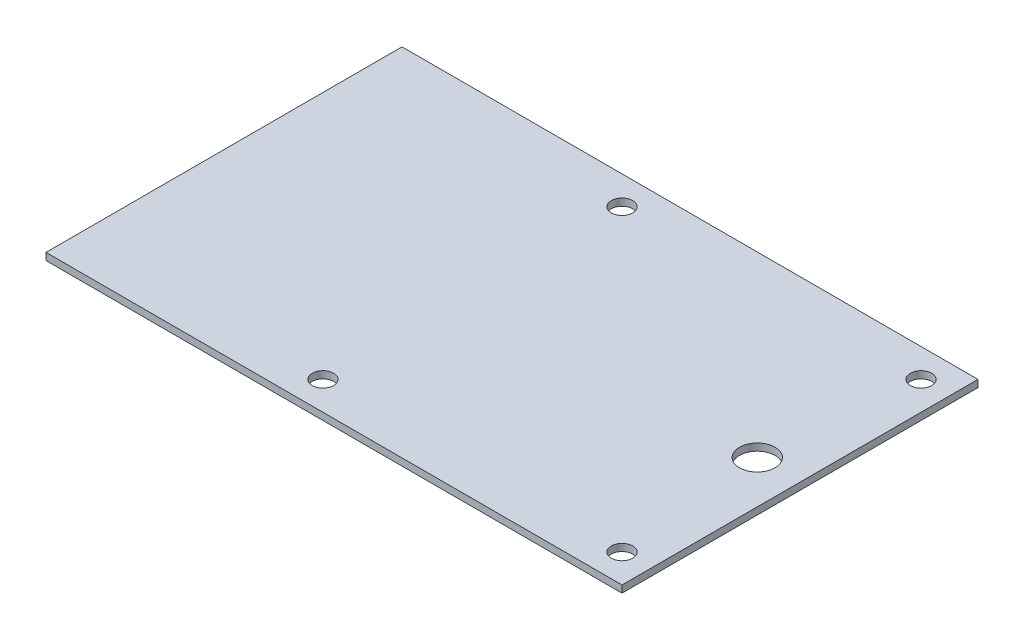
ISO-10303-21;
HEADER;
FILE_DESCRIPTION(('STEP AP214'),'2;1');
FILE_NAME('part.step','',(''),(''),'','','');
FILE_SCHEMA(('AUTOMOTIVE_DESIGN { 1 0 10303 214 1 1 1 1 }'));
ENDSEC;
DATA;
#1=APPLICATION_CONTEXT('core data for automotive mechanical design processes');
#2=APPLICATION_PROTOCOL_DEFINITION('international standard','automotive_design',2000,#1);
#3=PRODUCT_CONTEXT('',#1,'mechanical');
#4=PRODUCT('Part','Part','',(#3));
#5=PRODUCT_RELATED_PRODUCT_CATEGORY('part','',(#4));
#6=PRODUCT_DEFINITION_FORMATION('','',#4);
#7=PRODUCT_DEFINITION_CONTEXT('part definition',#1,'design');
#8=PRODUCT_DEFINITION('design','',#6,#7);
#9=PRODUCT_DEFINITION_SHAPE('','',#8);
#10=(LENGTH_UNIT() NAMED_UNIT(*) SI_UNIT(.MILLI.,.METRE.));
#11=(NAMED_UNIT(*) PLANE_ANGLE_UNIT() SI_UNIT($,.RADIAN.));
#12=(NAMED_UNIT(*) SI_UNIT($,.STERADIAN.) SOLID_ANGLE_UNIT());
#13=UNCERTAINTY_MEASURE_WITH_UNIT(LENGTH_MEASURE(1.E-05),#10,'distance_accuracy_value','');
#14=(GEOMETRIC_REPRESENTATION_CONTEXT(3) GLOBAL_UNCERTAINTY_ASSIGNED_CONTEXT((#13)) GLOBAL_UNIT_ASSIGNED_CONTEXT((#10,
#11,#12)) REPRESENTATION_CONTEXT('',''));
#15=CARTESIAN_POINT('',(0.,0.,0.));
#16=DIRECTION('',(0.,0.,1.));
#17=DIRECTION('',(1.,0.,0.));
#18=AXIS2_PLACEMENT_3D('',#15,#16,#17);
#19=CARTESIAN_POINT('',(40.45,1.,25.));
#20=DIRECTION('',(-1.,0.,0.));
#21=DIRECTION('',(0.,0.,1.));
#22=AXIS2_PLACEMENT_3D('',#19,#20,#21);
#23=PLANE('',#22);
#24=DIRECTION('',(0.,0.,-1.));
#25=VECTOR('',#24,1.);
#26=CARTESIAN_POINT('',(40.45,0.,25.));
#27=LINE('',#26,#25);
#28=CARTESIAN_POINT('',(40.45,0.,25.));
#29=VERTEX_POINT('',#28);
#30=CARTESIAN_POINT('',(40.45,0.,-25.));
#31=VERTEX_POINT('',#30);
#32=EDGE_CURVE('E97',#29,#31,#27,.T.);
#33=ORIENTED_EDGE('',*,*,#32,.T.);
#34=DIRECTION('',(0.,-1.,0.));
#35=VECTOR('',#34,1.);
#36=CARTESIAN_POINT('',(40.45,1.,-25.));
#37=LINE('',#36,#35);
#38=CARTESIAN_POINT('',(40.45,1.,-25.));
#39=VERTEX_POINT('',#38);
#40=EDGE_CURVE('E11',#39,#31,#37,.T.);
#41=ORIENTED_EDGE('',*,*,#40,.F.);
#42=DIRECTION('',(0.,0.,-1.));
#43=VECTOR('',#42,1.);
#44=CARTESIAN_POINT('',(40.45,1.,25.));
#45=LINE('',#44,#43);
#46=CARTESIAN_POINT('',(40.45,1.,25.));
#47=VERTEX_POINT('',#46);
#48=EDGE_CURVE('E85',#47,#39,#45,.T.);
#49=ORIENTED_EDGE('',*,*,#48,.F.);
#50=DIRECTION('',(0.,-1.,0.));
#51=VECTOR('',#50,1.);
#52=CARTESIAN_POINT('',(40.45,1.,25.));
#53=LINE('',#52,#51);
#54=EDGE_CURVE('E93',#47,#29,#53,.T.);
#55=ORIENTED_EDGE('',*,*,#54,.T.);
#56=EDGE_LOOP('',(#33,#41,#49,#55));
#57=FACE_BOUND('',#56,.T.);
#58=ADVANCED_FACE('F34',(#57),#23,.F.);
#59=CARTESIAN_POINT('',(-40.45,1.,-25.));
#60=DIRECTION('',(0.,0.,1.));
#61=DIRECTION('',(1.,0.,0.));
#62=AXIS2_PLACEMENT_3D('',#59,#60,#61);
#63=PLANE('',#62);
#64=DIRECTION('',(-1.,0.,0.));
#65=VECTOR('',#64,1.);
#66=CARTESIAN_POINT('',(-40.45,0.,-25.));
#67=LINE('',#66,#65);
#68=CARTESIAN_POINT('',(-40.45,0.,-25.));
#69=VERTEX_POINT('',#68);
#70=EDGE_CURVE('E89',#31,#69,#67,.T.);
#71=ORIENTED_EDGE('',*,*,#70,.T.);
#72=DIRECTION('',(0.,-1.,0.));
#73=VECTOR('',#72,1.);
#74=CARTESIAN_POINT('',(-40.45,1.,-25.));
#75=LINE('',#74,#73);
#76=CARTESIAN_POINT('',(-40.45,1.,-25.));
#77=VERTEX_POINT('',#76);
#78=EDGE_CURVE('E42',#77,#69,#75,.T.);
#79=ORIENTED_EDGE('',*,*,#78,.F.);
#80=DIRECTION('',(-1.,0.,0.));
#81=VECTOR('',#80,1.);
#82=CARTESIAN_POINT('',(-40.45,1.,-25.));
#83=LINE('',#82,#81);
#84=EDGE_CURVE('E80',#39,#77,#83,.T.);
#85=ORIENTED_EDGE('',*,*,#84,.F.);
#86=ORIENTED_EDGE('',*,*,#40,.T.);
#87=EDGE_LOOP('',(#71,#79,#85,#86));
#88=FACE_BOUND('',#87,.T.);
#89=ADVANCED_FACE('F88',(#88),#63,.F.);
#90=CARTESIAN_POINT('',(-40.45,1.,25.));
#91=DIRECTION('',(1.,0.,0.));
#92=DIRECTION('',(0.,0.,-1.));
#93=AXIS2_PLACEMENT_3D('',#90,#91,#92);
#94=PLANE('',#93);
#95=DIRECTION('',(0.,0.,1.));
#96=VECTOR('',#95,1.);
#97=CARTESIAN_POINT('',(-40.45,0.,25.));
#98=LINE('',#97,#96);
#99=CARTESIAN_POINT('',(-40.45,0.,25.));
#100=VERTEX_POINT('',#99);
#101=EDGE_CURVE('E67',#69,#100,#98,.T.);
#102=ORIENTED_EDGE('',*,*,#101,.T.);
#103=DIRECTION('',(0.,-1.,0.));
#104=VECTOR('',#103,1.);
#105=CARTESIAN_POINT('',(-40.45,1.,25.));
#106=LINE('',#105,#104);
#107=CARTESIAN_POINT('',(-40.45,1.,25.));
#108=VERTEX_POINT('',#107);
#109=EDGE_CURVE('E90',#108,#100,#106,.T.);
#110=ORIENTED_EDGE('',*,*,#109,.F.);
#111=DIRECTION('',(0.,0.,1.));
#112=VECTOR('',#111,1.);
#113=CARTESIAN_POINT('',(-40.45,1.,25.));
#114=LINE('',#113,#112);
#115=EDGE_CURVE('E83',#77,#108,#114,.T.);
#116=ORIENTED_EDGE('',*,*,#115,.F.);
#117=ORIENTED_EDGE('',*,*,#78,.T.);
#118=EDGE_LOOP('',(#102,#110,#116,#117));
#119=FACE_BOUND('',#118,.T.);
#120=ADVANCED_FACE('F91',(#119),#94,.F.);
#121=CARTESIAN_POINT('',(-40.45,1.,25.));
#122=DIRECTION('',(0.,0.,-1.));
#123=DIRECTION('',(-1.,0.,0.));
#124=AXIS2_PLACEMENT_3D('',#121,#122,#123);
#125=PLANE('',#124);
#126=DIRECTION('',(1.,0.,0.));
#127=VECTOR('',#126,1.);
#128=CARTESIAN_POINT('',(-40.45,0.,25.));
#129=LINE('',#128,#127);
#130=EDGE_CURVE('E73',#100,#29,#129,.T.);
#131=ORIENTED_EDGE('',*,*,#130,.T.);
#132=ORIENTED_EDGE('',*,*,#54,.F.);
#133=DIRECTION('',(1.,0.,0.));
#134=VECTOR('',#133,1.);
#135=CARTESIAN_POINT('',(-40.45,1.,25.));
#136=LINE('',#135,#134);
#137=EDGE_CURVE('E50',#108,#47,#136,.T.);
#138=ORIENTED_EDGE('',*,*,#137,.F.);
#139=ORIENTED_EDGE('',*,*,#109,.T.);
#140=EDGE_LOOP('',(#131,#132,#138,#139));
#141=FACE_BOUND('',#140,.T.);
#142=ADVANCED_FACE('F105',(#141),#125,.F.);
#143=CARTESIAN_POINT('',(0.,1.,0.));
#144=DIRECTION('',(0.,-1.,0.));
#145=DIRECTION('',(0.,0.,-1.));
#146=AXIS2_PLACEMENT_3D('',#143,#144,#145);
#147=PLANE('',#146);
#148=CARTESIAN_POINT('',(34.45,1.,0.));
#149=DIRECTION('',(0.,1.,0.));
#150=DIRECTION('',(0.,0.,1.));
#151=AXIS2_PLACEMENT_3D('',#148,#149,#150);
#152=CIRCLE('',#151,2.5);
#153=CARTESIAN_POINT('',(34.45,1.,2.5));
#154=VERTEX_POINT('',#153);
#155=EDGE_CURVE('E135',#154,#154,#152,.T.);
#156=ORIENTED_EDGE('',*,*,#155,.F.);
#157=EDGE_LOOP('',(#156));
#158=FACE_BOUND('',#157,.T.);
#159=CARTESIAN_POINT('',(-5.55,1.,-21.));
#160=DIRECTION('',(0.,1.,0.));
#161=DIRECTION('',(0.,0.,1.));
#162=AXIS2_PLACEMENT_3D('',#159,#160,#161);
#163=CIRCLE('',#162,1.5);
#164=CARTESIAN_POINT('',(-5.55,1.,-19.5));
#165=VERTEX_POINT('',#164);
#166=EDGE_CURVE('E129',#165,#165,#163,.T.);
#167=ORIENTED_EDGE('',*,*,#166,.F.);
#168=EDGE_LOOP('',(#167));
#169=FACE_BOUND('',#168,.T.);
#170=CARTESIAN_POINT('',(-5.55,1.,21.));
#171=DIRECTION('',(0.,1.,0.));
#172=DIRECTION('',(0.,0.,1.));
#173=AXIS2_PLACEMENT_3D('',#170,#171,#172);
#174=CIRCLE('',#173,1.5);
#175=CARTESIAN_POINT('',(-5.55,1.,22.5));
#176=VERTEX_POINT('',#175);
#177=EDGE_CURVE('E123',#176,#176,#174,.T.);
#178=ORIENTED_EDGE('',*,*,#177,.F.);
#179=EDGE_LOOP('',(#178));
#180=FACE_BOUND('',#179,.T.);
#181=CARTESIAN_POINT('',(36.45,1.,21.));
#182=DIRECTION('',(0.,1.,0.));
#183=DIRECTION('',(0.,0.,1.));
#184=AXIS2_PLACEMENT_3D('',#181,#182,#183);
#185=CIRCLE('',#184,1.5);
#186=CARTESIAN_POINT('',(36.45,1.,22.5));
#187=VERTEX_POINT('',#186);
#188=EDGE_CURVE('E117',#187,#187,#185,.T.);
#189=ORIENTED_EDGE('',*,*,#188,.F.);
#190=EDGE_LOOP('',(#189));
#191=FACE_BOUND('',#190,.T.);
#192=CARTESIAN_POINT('',(36.45,1.,-21.));
#193=DIRECTION('',(0.,1.,0.));
#194=DIRECTION('',(0.,0.,1.));
#195=AXIS2_PLACEMENT_3D('',#192,#193,#194);
#196=CIRCLE('',#195,1.5);
#197=CARTESIAN_POINT('',(36.45,1.,-19.5));
#198=VERTEX_POINT('',#197);
#199=EDGE_CURVE('E111',#198,#198,#196,.T.);
#200=ORIENTED_EDGE('',*,*,#199,.F.);
#201=EDGE_LOOP('',(#200));
#202=FACE_BOUND('',#201,.T.);
#203=ORIENTED_EDGE('',*,*,#48,.T.);
#204=ORIENTED_EDGE('',*,*,#84,.T.);
#205=ORIENTED_EDGE('',*,*,#115,.T.);
#206=ORIENTED_EDGE('',*,*,#137,.T.);
#207=EDGE_LOOP('',(#203,#204,#205,#206));
#208=FACE_BOUND('',#207,.T.);
#209=ADVANCED_FACE('F81',(#158,#169,#180,#191,#202,#208),#147,.F.);
#210=CARTESIAN_POINT('',(0.,0.,0.));
#211=DIRECTION('',(0.,-1.,0.));
#212=DIRECTION('',(0.,0.,-1.));
#213=AXIS2_PLACEMENT_3D('',#210,#211,#212);
#214=PLANE('',#213);
#215=CARTESIAN_POINT('',(34.45,0.,0.));
#216=DIRECTION('',(0.,1.,0.));
#217=DIRECTION('',(0.,0.,1.));
#218=AXIS2_PLACEMENT_3D('',#215,#216,#217);
#219=CIRCLE('',#218,2.5);
#220=CARTESIAN_POINT('',(34.45,0.,2.5));
#221=VERTEX_POINT('',#220);
#222=EDGE_CURVE('E132',#221,#221,#219,.T.);
#223=ORIENTED_EDGE('',*,*,#222,.T.);
#224=EDGE_LOOP('',(#223));
#225=FACE_BOUND('',#224,.T.);
#226=CARTESIAN_POINT('',(-5.55,0.,-21.));
#227=DIRECTION('',(0.,1.,0.));
#228=DIRECTION('',(0.,0.,1.));
#229=AXIS2_PLACEMENT_3D('',#226,#227,#228);
#230=CIRCLE('',#229,1.5);
#231=CARTESIAN_POINT('',(-5.55,0.,-19.5));
#232=VERTEX_POINT('',#231);
#233=EDGE_CURVE('E126',#232,#232,#230,.T.);
#234=ORIENTED_EDGE('',*,*,#233,.T.);
#235=EDGE_LOOP('',(#234));
#236=FACE_BOUND('',#235,.T.);
#237=CARTESIAN_POINT('',(-5.55,0.,21.));
#238=DIRECTION('',(0.,1.,0.));
#239=DIRECTION('',(0.,0.,1.));
#240=AXIS2_PLACEMENT_3D('',#237,#238,#239);
#241=CIRCLE('',#240,1.5);
#242=CARTESIAN_POINT('',(-5.55,0.,22.5));
#243=VERTEX_POINT('',#242);
#244=EDGE_CURVE('E120',#243,#243,#241,.T.);
#245=ORIENTED_EDGE('',*,*,#244,.T.);
#246=EDGE_LOOP('',(#245));
#247=FACE_BOUND('',#246,.T.);
#248=CARTESIAN_POINT('',(36.45,0.,21.));
#249=DIRECTION('',(0.,1.,0.));
#250=DIRECTION('',(0.,0.,1.));
#251=AXIS2_PLACEMENT_3D('',#248,#249,#250);
#252=CIRCLE('',#251,1.5);
#253=CARTESIAN_POINT('',(36.45,0.,22.5));
#254=VERTEX_POINT('',#253);
#255=EDGE_CURVE('E114',#254,#254,#252,.T.);
#256=ORIENTED_EDGE('',*,*,#255,.T.);
#257=EDGE_LOOP('',(#256));
#258=FACE_BOUND('',#257,.T.);
#259=CARTESIAN_POINT('',(36.45,0.,-21.));
#260=DIRECTION('',(0.,1.,0.));
#261=DIRECTION('',(0.,0.,1.));
#262=AXIS2_PLACEMENT_3D('',#259,#260,#261);
#263=CIRCLE('',#262,1.5);
#264=CARTESIAN_POINT('',(36.45,0.,-19.5));
#265=VERTEX_POINT('',#264);
#266=EDGE_CURVE('E100',#265,#265,#263,.T.);
#267=ORIENTED_EDGE('',*,*,#266,.T.);
#268=EDGE_LOOP('',(#267));
#269=FACE_BOUND('',#268,.T.);
#270=ORIENTED_EDGE('',*,*,#32,.F.);
#271=ORIENTED_EDGE('',*,*,#130,.F.);
#272=ORIENTED_EDGE('',*,*,#101,.F.);
#273=ORIENTED_EDGE('',*,*,#70,.F.);
#274=EDGE_LOOP('',(#270,#271,#272,#273));
#275=FACE_BOUND('',#274,.T.);
#276=ADVANCED_FACE('F108',(#225,#236,#247,#258,#269,#275),#214,.T.);
#277=CARTESIAN_POINT('',(36.45,0.,-21.));
#278=DIRECTION('',(0.,1.,0.));
#279=DIRECTION('',(0.,0.,1.));
#280=AXIS2_PLACEMENT_3D('',#277,#278,#279);
#281=CYLINDRICAL_SURFACE('',#280,1.5);
#282=ORIENTED_EDGE('',*,*,#266,.F.);
#283=EDGE_LOOP('',(#282));
#284=FACE_BOUND('',#283,.T.);
#285=ORIENTED_EDGE('',*,*,#199,.T.);
#286=EDGE_LOOP('',(#285));
#287=FACE_BOUND('',#286,.T.);
#288=ADVANCED_FACE('F161',(#284,#287),#281,.F.);
#289=CARTESIAN_POINT('',(36.45,0.,21.));
#290=DIRECTION('',(0.,1.,0.));
#291=DIRECTION('',(0.,0.,1.));
#292=AXIS2_PLACEMENT_3D('',#289,#290,#291);
#293=CYLINDRICAL_SURFACE('',#292,1.5);
#294=ORIENTED_EDGE('',*,*,#255,.F.);
#295=EDGE_LOOP('',(#294));
#296=FACE_BOUND('',#295,.T.);
#297=ORIENTED_EDGE('',*,*,#188,.T.);
#298=EDGE_LOOP('',(#297));
#299=FACE_BOUND('',#298,.T.);
#300=ADVANCED_FACE('F163',(#296,#299),#293,.F.);
#301=CARTESIAN_POINT('',(-5.55,0.,21.));
#302=DIRECTION('',(0.,1.,0.));
#303=DIRECTION('',(0.,0.,1.));
#304=AXIS2_PLACEMENT_3D('',#301,#302,#303);
#305=CYLINDRICAL_SURFACE('',#304,1.5);
#306=ORIENTED_EDGE('',*,*,#244,.F.);
#307=EDGE_LOOP('',(#306));
#308=FACE_BOUND('',#307,.T.);
#309=ORIENTED_EDGE('',*,*,#177,.T.);
#310=EDGE_LOOP('',(#309));
#311=FACE_BOUND('',#310,.T.);
#312=ADVANCED_FACE('F170',(#308,#311),#305,.F.);
#313=CARTESIAN_POINT('',(-5.55,0.,-21.));
#314=DIRECTION('',(0.,1.,0.));
#315=DIRECTION('',(0.,0.,1.));
#316=AXIS2_PLACEMENT_3D('',#313,#314,#315);
#317=CYLINDRICAL_SURFACE('',#316,1.5);
#318=ORIENTED_EDGE('',*,*,#233,.F.);
#319=EDGE_LOOP('',(#318));
#320=FACE_BOUND('',#319,.T.);
#321=ORIENTED_EDGE('',*,*,#166,.T.);
#322=EDGE_LOOP('',(#321));
#323=FACE_BOUND('',#322,.T.);
#324=ADVANCED_FACE('F146',(#320,#323),#317,.F.);
#325=CARTESIAN_POINT('',(34.45,0.,0.));
#326=DIRECTION('',(0.,1.,0.));
#327=DIRECTION('',(0.,0.,1.));
#328=AXIS2_PLACEMENT_3D('',#325,#326,#327);
#329=CYLINDRICAL_SURFACE('',#328,2.5);
#330=ORIENTED_EDGE('',*,*,#222,.F.);
#331=EDGE_LOOP('',(#330));
#332=FACE_BOUND('',#331,.T.);
#333=ORIENTED_EDGE('',*,*,#155,.T.);
#334=EDGE_LOOP('',(#333));
#335=FACE_BOUND('',#334,.T.);
#336=ADVANCED_FACE('F143',(#332,#335),#329,.F.);
#337=CLOSED_SHELL('',(#58,#89,#120,#142,#209,#276,#288,#300,#312,#324,#336));
#338=MANIFOLD_SOLID_BREP('B2',#337);
#339=ADVANCED_BREP_SHAPE_REPRESENTATION('',(#18,#338),#14);
#340=SHAPE_DEFINITION_REPRESENTATION(#9,#339);
ENDSEC;
END-ISO-10303-21;
